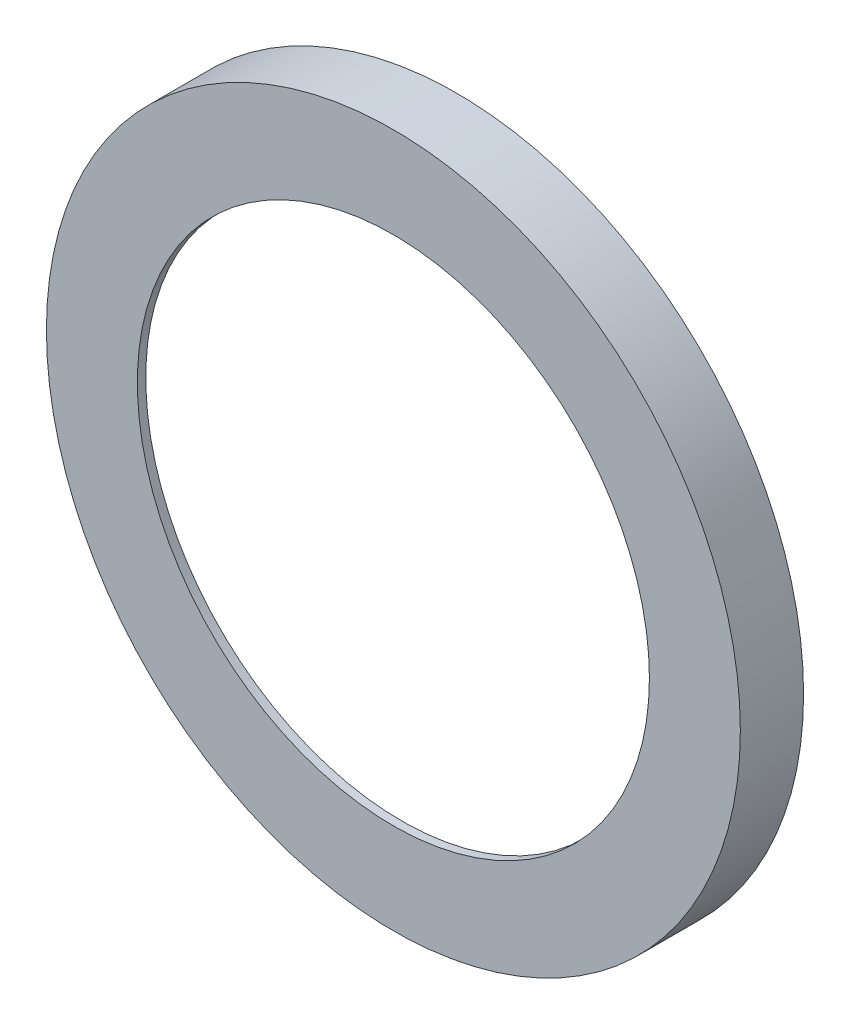
ISO-10303-21;
HEADER;
FILE_DESCRIPTION(('STEP AP214'),'2;1');
FILE_NAME('part.step','',(''),(''),'','','');
FILE_SCHEMA(('AUTOMOTIVE_DESIGN { 1 0 10303 214 1 1 1 1 }'));
ENDSEC;
DATA;
#1=APPLICATION_CONTEXT('core data for automotive mechanical design processes');
#2=APPLICATION_PROTOCOL_DEFINITION('international standard','automotive_design',2000,#1);
#3=PRODUCT_CONTEXT('',#1,'mechanical');
#4=PRODUCT('Part','Part','',(#3));
#5=PRODUCT_RELATED_PRODUCT_CATEGORY('part','',(#4));
#6=PRODUCT_DEFINITION_FORMATION('','',#4);
#7=PRODUCT_DEFINITION_CONTEXT('part definition',#1,'design');
#8=PRODUCT_DEFINITION('design','',#6,#7);
#9=PRODUCT_DEFINITION_SHAPE('','',#8);
#10=(LENGTH_UNIT() NAMED_UNIT(*) SI_UNIT(.MILLI.,.METRE.));
#11=(NAMED_UNIT(*) PLANE_ANGLE_UNIT() SI_UNIT($,.RADIAN.));
#12=(NAMED_UNIT(*) SI_UNIT($,.STERADIAN.) SOLID_ANGLE_UNIT());
#13=UNCERTAINTY_MEASURE_WITH_UNIT(LENGTH_MEASURE(1.E-05),#10,'distance_accuracy_value','');
#14=(GEOMETRIC_REPRESENTATION_CONTEXT(3) GLOBAL_UNCERTAINTY_ASSIGNED_CONTEXT((#13)) GLOBAL_UNIT_ASSIGNED_CONTEXT((#10,
#11,#12)) REPRESENTATION_CONTEXT('',''));
#15=CARTESIAN_POINT('',(0.,0.,0.));
#16=DIRECTION('',(0.,0.,1.));
#17=DIRECTION('',(1.,0.,0.));
#18=AXIS2_PLACEMENT_3D('',#15,#16,#17);
#19=CARTESIAN_POINT('',(104.510774546973,0.,-2.522185058788));
#20=DIRECTION('',(0.,0.,1.));
#21=DIRECTION('',(1.,0.,0.));
#22=AXIS2_PLACEMENT_3D('',#19,#20,#21);
#23=PLANE('',#22);
#24=CARTESIAN_POINT('',(0.,0.,-2.52218505878801));
#25=DIRECTION('',(0.,0.,1.));
#26=DIRECTION('',(1.,0.,0.));
#27=AXIS2_PLACEMENT_3D('',#24,#25,#26);
#28=CIRCLE('',#27,104.510774546973);
#29=CARTESIAN_POINT('',(104.510774546973,0.,-2.52218505878801));
#30=VERTEX_POINT('',#29);
#31=EDGE_CURVE('E62',#30,#30,#28,.T.);
#32=ORIENTED_EDGE('',*,*,#31,.T.);
#33=EDGE_LOOP('',(#32));
#34=FACE_BOUND('',#33,.T.);
#35=CARTESIAN_POINT('',(0.,0.,-2.522185058788));
#36=DIRECTION('',(0.,0.,1.));
#37=DIRECTION('',(1.,0.,0.));
#38=AXIS2_PLACEMENT_3D('',#35,#36,#37);
#39=CIRCLE('',#38,77.1220509556606);
#40=CARTESIAN_POINT('',(77.1220509556606,0.,-2.522185058788));
#41=VERTEX_POINT('',#40);
#42=EDGE_CURVE('E10',#41,#41,#39,.T.);
#43=ORIENTED_EDGE('',*,*,#42,.F.);
#44=EDGE_LOOP('',(#43));
#45=FACE_BOUND('',#44,.T.);
#46=ADVANCED_FACE('F43',(#34,#45),#23,.T.);
#47=CARTESIAN_POINT('',(0.,0.,0.));
#48=DIRECTION('',(0.,0.,1.));
#49=DIRECTION('',(1.,0.,0.));
#50=AXIS2_PLACEMENT_3D('',#47,#48,#49);
#51=CYLINDRICAL_SURFACE('',#50,77.1220509556606);
#52=ORIENTED_EDGE('',*,*,#42,.T.);
#53=EDGE_LOOP('',(#52));
#54=FACE_BOUND('',#53,.T.);
#55=CARTESIAN_POINT('',(0.,0.,-5.062185058788));
#56=DIRECTION('',(0.,0.,1.));
#57=DIRECTION('',(1.,0.,0.));
#58=AXIS2_PLACEMENT_3D('',#55,#56,#57);
#59=CIRCLE('',#58,77.1220509556606);
#60=CARTESIAN_POINT('',(77.1220509556606,0.,-5.062185058788));
#61=VERTEX_POINT('',#60);
#62=EDGE_CURVE('E49',#61,#61,#59,.T.);
#63=ORIENTED_EDGE('',*,*,#62,.F.);
#64=EDGE_LOOP('',(#63));
#65=FACE_BOUND('',#64,.T.);
#66=ADVANCED_FACE('F80',(#54,#65),#51,.F.);
#67=CARTESIAN_POINT('',(0.,0.,-21.572185058788));
#68=DIRECTION('',(0.,0.,-1.));
#69=DIRECTION('',(-1.,0.,0.));
#70=AXIS2_PLACEMENT_3D('',#67,#68,#69);
#71=CONICAL_SURFACE('',#70,100.700774546973,0.959931088596886);
#72=ORIENTED_EDGE('',*,*,#62,.T.);
#73=EDGE_LOOP('',(#72));
#74=FACE_BOUND('',#73,.T.);
#75=CARTESIAN_POINT('',(0.,0.,-21.572185058788));
#76=DIRECTION('',(0.,0.,1.));
#77=DIRECTION('',(1.,0.,0.));
#78=AXIS2_PLACEMENT_3D('',#75,#76,#77);
#79=CIRCLE('',#78,100.700774546973);
#80=CARTESIAN_POINT('',(100.700774546973,0.,-21.572185058788));
#81=VERTEX_POINT('',#80);
#82=EDGE_CURVE('E53',#81,#81,#79,.T.);
#83=ORIENTED_EDGE('',*,*,#82,.F.);
#84=EDGE_LOOP('',(#83));
#85=FACE_BOUND('',#84,.T.);
#86=ADVANCED_FACE('F76',(#74,#85),#71,.F.);
#87=CARTESIAN_POINT('',(100.700774546973,0.,-21.572185058788));
#88=DIRECTION('',(0.,0.,-1.));
#89=DIRECTION('',(-1.,0.,0.));
#90=AXIS2_PLACEMENT_3D('',#87,#88,#89);
#91=PLANE('',#90);
#92=ORIENTED_EDGE('',*,*,#82,.T.);
#93=EDGE_LOOP('',(#92));
#94=FACE_BOUND('',#93,.T.);
#95=CARTESIAN_POINT('',(0.,0.,-21.572185058788));
#96=DIRECTION('',(0.,0.,1.));
#97=DIRECTION('',(1.,0.,0.));
#98=AXIS2_PLACEMENT_3D('',#95,#96,#97);
#99=CIRCLE('',#98,104.510774546973);
#100=CARTESIAN_POINT('',(104.510774546973,0.,-21.572185058788));
#101=VERTEX_POINT('',#100);
#102=EDGE_CURVE('E57',#101,#101,#99,.T.);
#103=ORIENTED_EDGE('',*,*,#102,.F.);
#104=EDGE_LOOP('',(#103));
#105=FACE_BOUND('',#104,.T.);
#106=ADVANCED_FACE('F70',(#94,#105),#91,.T.);
#107=CARTESIAN_POINT('',(0.,0.,0.));
#108=DIRECTION('',(0.,0.,1.));
#109=DIRECTION('',(1.,0.,0.));
#110=AXIS2_PLACEMENT_3D('',#107,#108,#109);
#111=CYLINDRICAL_SURFACE('',#110,104.510774546973);
#112=ORIENTED_EDGE('',*,*,#102,.T.);
#113=EDGE_LOOP('',(#112));
#114=FACE_BOUND('',#113,.T.);
#115=ORIENTED_EDGE('',*,*,#31,.F.);
#116=EDGE_LOOP('',(#115));
#117=FACE_BOUND('',#116,.T.);
#118=ADVANCED_FACE('F68',(#114,#117),#111,.T.);
#119=CLOSED_SHELL('',(#46,#66,#86,#106,#118));
#120=MANIFOLD_SOLID_BREP('B2',#119);
#121=ADVANCED_BREP_SHAPE_REPRESENTATION('',(#18,#120),#14);
#122=SHAPE_DEFINITION_REPRESENTATION(#9,#121);
ENDSEC;
END-ISO-10303-21;
